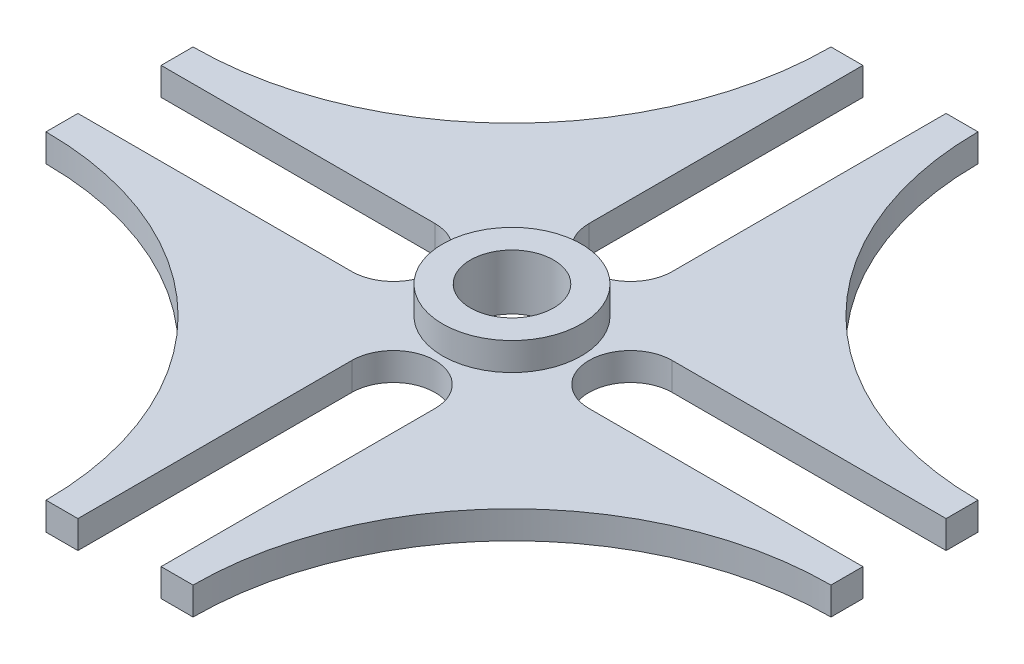
ISO-10303-21;
HEADER;
FILE_DESCRIPTION(('STEP AP214'),'2;1');
FILE_NAME('part.step','',(''),(''),'','','');
FILE_SCHEMA(('AUTOMOTIVE_DESIGN { 1 0 10303 214 1 1 1 1 }'));
ENDSEC;
DATA;
#1=APPLICATION_CONTEXT('core data for automotive mechanical design processes');
#2=APPLICATION_PROTOCOL_DEFINITION('international standard','automotive_design',2000,#1);
#3=PRODUCT_CONTEXT('',#1,'mechanical');
#4=PRODUCT('Part','Part','',(#3));
#5=PRODUCT_RELATED_PRODUCT_CATEGORY('part','',(#4));
#6=PRODUCT_DEFINITION_FORMATION('','',#4);
#7=PRODUCT_DEFINITION_CONTEXT('part definition',#1,'design');
#8=PRODUCT_DEFINITION('design','',#6,#7);
#9=PRODUCT_DEFINITION_SHAPE('','',#8);
#10=(LENGTH_UNIT() NAMED_UNIT(*) SI_UNIT(.MILLI.,.METRE.));
#11=(NAMED_UNIT(*) PLANE_ANGLE_UNIT() SI_UNIT($,.RADIAN.));
#12=(NAMED_UNIT(*) SI_UNIT($,.STERADIAN.) SOLID_ANGLE_UNIT());
#13=UNCERTAINTY_MEASURE_WITH_UNIT(LENGTH_MEASURE(1.E-05),#10,'distance_accuracy_value','');
#14=(GEOMETRIC_REPRESENTATION_CONTEXT(3) GLOBAL_UNCERTAINTY_ASSIGNED_CONTEXT((#13)) GLOBAL_UNIT_ASSIGNED_CONTEXT((#10,
#11,#12)) REPRESENTATION_CONTEXT('',''));
#15=CARTESIAN_POINT('',(0.,0.,0.));
#16=DIRECTION('',(0.,0.,1.));
#17=DIRECTION('',(1.,0.,0.));
#18=AXIS2_PLACEMENT_3D('',#15,#16,#17);
#19=CARTESIAN_POINT('',(6.,4.,-56.6));
#20=DIRECTION('',(0.,0.,1.));
#21=DIRECTION('',(1.,0.,0.));
#22=AXIS2_PLACEMENT_3D('',#19,#20,#21);
#23=PLANE('',#22);
#24=DIRECTION('',(-1.,0.,0.));
#25=VECTOR('',#24,1.);
#26=CARTESIAN_POINT('',(6.,0.,-56.6));
#27=LINE('',#26,#25);
#28=CARTESIAN_POINT('',(10.6,0.,-56.6));
#29=VERTEX_POINT('',#28);
#30=CARTESIAN_POINT('',(6.,0.,-56.6));
#31=VERTEX_POINT('',#30);
#32=EDGE_CURVE('E522',#29,#31,#27,.T.);
#33=ORIENTED_EDGE('',*,*,#32,.T.);
#34=DIRECTION('',(0.,-1.,0.));
#35=VECTOR('',#34,1.);
#36=CARTESIAN_POINT('',(6.,4.,-56.6));
#37=LINE('',#36,#35);
#38=CARTESIAN_POINT('',(6.,4.,-56.6));
#39=VERTEX_POINT('',#38);
#40=EDGE_CURVE('E12',#39,#31,#37,.T.);
#41=ORIENTED_EDGE('',*,*,#40,.F.);
#42=DIRECTION('',(-1.,0.,0.));
#43=VECTOR('',#42,1.);
#44=CARTESIAN_POINT('',(6.,4.,-56.6));
#45=LINE('',#44,#43);
#46=CARTESIAN_POINT('',(10.6,4.,-56.6));
#47=VERTEX_POINT('',#46);
#48=EDGE_CURVE('E478',#47,#39,#45,.T.);
#49=ORIENTED_EDGE('',*,*,#48,.F.);
#50=DIRECTION('',(0.,-1.,0.));
#51=VECTOR('',#50,1.);
#52=CARTESIAN_POINT('',(10.6,4.,-56.6));
#53=LINE('',#52,#51);
#54=EDGE_CURVE('E241',#47,#29,#53,.T.);
#55=ORIENTED_EDGE('',*,*,#54,.T.);
#56=EDGE_LOOP('',(#33,#41,#49,#55));
#57=FACE_BOUND('',#56,.T.);
#58=ADVANCED_FACE('F47',(#57),#23,.F.);
#59=CARTESIAN_POINT('',(6.,4.,-56.6));
#60=DIRECTION('',(1.,0.,0.));
#61=DIRECTION('',(0.,0.,-1.));
#62=AXIS2_PLACEMENT_3D('',#59,#60,#61);
#63=PLANE('',#62);
#64=DIRECTION('',(0.,0.,1.));
#65=VECTOR('',#64,1.);
#66=CARTESIAN_POINT('',(6.,0.,-56.6));
#67=LINE('',#66,#65);
#68=CARTESIAN_POINT('',(6.,0.,-17.1));
#69=VERTEX_POINT('',#68);
#70=EDGE_CURVE('E519',#31,#69,#67,.T.);
#71=ORIENTED_EDGE('',*,*,#70,.T.);
#72=DIRECTION('',(0.,-1.,0.));
#73=VECTOR('',#72,1.);
#74=CARTESIAN_POINT('',(6.,4.,-17.1));
#75=LINE('',#74,#73);
#76=CARTESIAN_POINT('',(6.,4.,-17.1));
#77=VERTEX_POINT('',#76);
#78=EDGE_CURVE('E57',#77,#69,#75,.T.);
#79=ORIENTED_EDGE('',*,*,#78,.F.);
#80=DIRECTION('',(0.,0.,1.));
#81=VECTOR('',#80,1.);
#82=CARTESIAN_POINT('',(6.,4.,-56.6));
#83=LINE('',#82,#81);
#84=EDGE_CURVE('E156',#39,#77,#83,.T.);
#85=ORIENTED_EDGE('',*,*,#84,.F.);
#86=ORIENTED_EDGE('',*,*,#40,.T.);
#87=EDGE_LOOP('',(#71,#79,#85,#86));
#88=FACE_BOUND('',#87,.T.);
#89=ADVANCED_FACE('F934',(#88),#63,.F.);
#90=CARTESIAN_POINT('',(0.,4.,-17.1));
#91=DIRECTION('',(0.,-1.,0.));
#92=DIRECTION('',(0.,0.,-1.));
#93=AXIS2_PLACEMENT_3D('',#90,#91,#92);
#94=CYLINDRICAL_SURFACE('',#93,6.);
#95=CARTESIAN_POINT('',(0.,0.,-17.1));
#96=DIRECTION('',(0.,-1.,0.));
#97=DIRECTION('',(0.,0.,1.));
#98=AXIS2_PLACEMENT_3D('',#95,#96,#97);
#99=CIRCLE('',#98,6.);
#100=CARTESIAN_POINT('',(-6.,0.,-17.1));
#101=VERTEX_POINT('',#100);
#102=EDGE_CURVE('E500',#69,#101,#99,.T.);
#103=ORIENTED_EDGE('',*,*,#102,.T.);
#104=DIRECTION('',(0.,-1.,0.));
#105=VECTOR('',#104,1.);
#106=CARTESIAN_POINT('',(-6.,4.,-17.1));
#107=LINE('',#106,#105);
#108=CARTESIAN_POINT('',(-6.,4.,-17.1));
#109=VERTEX_POINT('',#108);
#110=EDGE_CURVE('E672',#109,#101,#107,.T.);
#111=ORIENTED_EDGE('',*,*,#110,.F.);
#112=CARTESIAN_POINT('',(0.,4.,-17.1));
#113=DIRECTION('',(0.,-1.,0.));
#114=DIRECTION('',(0.,0.,1.));
#115=AXIS2_PLACEMENT_3D('',#112,#113,#114);
#116=CIRCLE('',#115,6.);
#117=EDGE_CURVE('E450',#77,#109,#116,.T.);
#118=ORIENTED_EDGE('',*,*,#117,.F.);
#119=ORIENTED_EDGE('',*,*,#78,.T.);
#120=EDGE_LOOP('',(#103,#111,#118,#119));
#121=FACE_BOUND('',#120,.T.);
#122=ADVANCED_FACE('F938',(#121),#94,.F.);
#123=CARTESIAN_POINT('',(-6.,4.,-17.1));
#124=DIRECTION('',(-1.,0.,0.));
#125=DIRECTION('',(0.,0.,1.));
#126=AXIS2_PLACEMENT_3D('',#123,#124,#125);
#127=PLANE('',#126);
#128=DIRECTION('',(0.,0.,-1.));
#129=VECTOR('',#128,1.);
#130=CARTESIAN_POINT('',(-6.,0.,-17.1));
#131=LINE('',#130,#129);
#132=CARTESIAN_POINT('',(-6.00000000000001,0.,-56.6));
#133=VERTEX_POINT('',#132);
#134=EDGE_CURVE('E495',#101,#133,#131,.T.);
#135=ORIENTED_EDGE('',*,*,#134,.T.);
#136=DIRECTION('',(0.,-1.,0.));
#137=VECTOR('',#136,1.);
#138=CARTESIAN_POINT('',(-6.00000000000001,4.,-56.6));
#139=LINE('',#138,#137);
#140=CARTESIAN_POINT('',(-6.00000000000001,4.,-56.6));
#141=VERTEX_POINT('',#140);
#142=EDGE_CURVE('E687',#141,#133,#139,.T.);
#143=ORIENTED_EDGE('',*,*,#142,.F.);
#144=DIRECTION('',(0.,0.,-1.));
#145=VECTOR('',#144,1.);
#146=CARTESIAN_POINT('',(-6.,4.,-17.1));
#147=LINE('',#146,#145);
#148=EDGE_CURVE('E433',#109,#141,#147,.T.);
#149=ORIENTED_EDGE('',*,*,#148,.F.);
#150=ORIENTED_EDGE('',*,*,#110,.T.);
#151=EDGE_LOOP('',(#135,#143,#149,#150));
#152=FACE_BOUND('',#151,.T.);
#153=ADVANCED_FACE('F942',(#152),#127,.F.);
#154=CARTESIAN_POINT('',(-10.6,4.,-56.6));
#155=DIRECTION('',(0.,0.,1.));
#156=DIRECTION('',(1.,0.,0.));
#157=AXIS2_PLACEMENT_3D('',#154,#155,#156);
#158=PLANE('',#157);
#159=DIRECTION('',(-1.,0.,0.));
#160=VECTOR('',#159,1.);
#161=CARTESIAN_POINT('',(-10.6,0.,-56.6));
#162=LINE('',#161,#160);
#163=CARTESIAN_POINT('',(-10.6,0.,-56.6));
#164=VERTEX_POINT('',#163);
#165=EDGE_CURVE('E499',#133,#164,#162,.T.);
#166=ORIENTED_EDGE('',*,*,#165,.T.);
#167=DIRECTION('',(0.,-1.,0.));
#168=VECTOR('',#167,1.);
#169=CARTESIAN_POINT('',(-10.6,4.,-56.6));
#170=LINE('',#169,#168);
#171=CARTESIAN_POINT('',(-10.6,4.,-56.6));
#172=VERTEX_POINT('',#171);
#173=EDGE_CURVE('E692',#172,#164,#170,.T.);
#174=ORIENTED_EDGE('',*,*,#173,.F.);
#175=DIRECTION('',(-1.,0.,0.));
#176=VECTOR('',#175,1.);
#177=CARTESIAN_POINT('',(-10.6,4.,-56.6));
#178=LINE('',#177,#176);
#179=EDGE_CURVE('E430',#141,#172,#178,.T.);
#180=ORIENTED_EDGE('',*,*,#179,.F.);
#181=ORIENTED_EDGE('',*,*,#142,.T.);
#182=EDGE_LOOP('',(#166,#174,#180,#181));
#183=FACE_BOUND('',#182,.T.);
#184=ADVANCED_FACE('F948',(#183),#158,.F.);
#185=CARTESIAN_POINT('',(-56.6,4.,-56.6));
#186=DIRECTION('',(0.,-1.,0.));
#187=DIRECTION('',(0.,0.,-1.));
#188=AXIS2_PLACEMENT_3D('',#185,#186,#187);
#189=CYLINDRICAL_SURFACE('',#188,46.);
#190=CARTESIAN_POINT('',(-56.6,0.,-56.6));
#191=DIRECTION('',(0.,-1.,0.));
#192=DIRECTION('',(0.,0.,1.));
#193=AXIS2_PLACEMENT_3D('',#190,#191,#192);
#194=CIRCLE('',#193,46.);
#195=CARTESIAN_POINT('',(-56.6,0.,-10.6));
#196=VERTEX_POINT('',#195);
#197=EDGE_CURVE('E858',#164,#196,#194,.T.);
#198=ORIENTED_EDGE('',*,*,#197,.T.);
#199=DIRECTION('',(0.,-1.,0.));
#200=VECTOR('',#199,1.);
#201=CARTESIAN_POINT('',(-56.6,4.,-10.6));
#202=LINE('',#201,#200);
#203=CARTESIAN_POINT('',(-56.6,4.,-10.6));
#204=VERTEX_POINT('',#203);
#205=EDGE_CURVE('E1180',#204,#196,#202,.T.);
#206=ORIENTED_EDGE('',*,*,#205,.F.);
#207=CARTESIAN_POINT('',(-56.6,4.,-56.6));
#208=DIRECTION('',(0.,-1.,0.));
#209=DIRECTION('',(0.,0.,1.));
#210=AXIS2_PLACEMENT_3D('',#207,#208,#209);
#211=CIRCLE('',#210,46.);
#212=EDGE_CURVE('E413',#172,#204,#211,.T.);
#213=ORIENTED_EDGE('',*,*,#212,.F.);
#214=ORIENTED_EDGE('',*,*,#173,.T.);
#215=EDGE_LOOP('',(#198,#206,#213,#214));
#216=FACE_BOUND('',#215,.T.);
#217=ADVANCED_FACE('F952',(#216),#189,.F.);
#218=CARTESIAN_POINT('',(-56.6,4.,-5.99999999999999));
#219=DIRECTION('',(1.,0.,0.));
#220=DIRECTION('',(0.,0.,-1.));
#221=AXIS2_PLACEMENT_3D('',#218,#219,#220);
#222=PLANE('',#221);
#223=DIRECTION('',(0.,0.,1.));
#224=VECTOR('',#223,1.);
#225=CARTESIAN_POINT('',(-56.6,0.,-5.99999999999999));
#226=LINE('',#225,#224);
#227=CARTESIAN_POINT('',(-56.6,0.,-5.99999999999999));
#228=VERTEX_POINT('',#227);
#229=EDGE_CURVE('E543',#196,#228,#226,.T.);
#230=ORIENTED_EDGE('',*,*,#229,.T.);
#231=DIRECTION('',(0.,-1.,0.));
#232=VECTOR('',#231,1.);
#233=CARTESIAN_POINT('',(-56.6,4.,-5.99999999999999));
#234=LINE('',#233,#232);
#235=CARTESIAN_POINT('',(-56.6,4.,-5.99999999999999));
#236=VERTEX_POINT('',#235);
#237=EDGE_CURVE('E735',#236,#228,#234,.T.);
#238=ORIENTED_EDGE('',*,*,#237,.F.);
#239=DIRECTION('',(0.,0.,1.));
#240=VECTOR('',#239,1.);
#241=CARTESIAN_POINT('',(-56.6,4.,-5.99999999999999));
#242=LINE('',#241,#240);
#243=EDGE_CURVE('E410',#204,#236,#242,.T.);
#244=ORIENTED_EDGE('',*,*,#243,.F.);
#245=ORIENTED_EDGE('',*,*,#205,.T.);
#246=EDGE_LOOP('',(#230,#238,#244,#245));
#247=FACE_BOUND('',#246,.T.);
#248=ADVANCED_FACE('F956',(#247),#222,.F.);
#249=CARTESIAN_POINT('',(-56.6,4.,-5.99999999999999));
#250=DIRECTION('',(0.,0.,-1.));
#251=DIRECTION('',(-1.,0.,0.));
#252=AXIS2_PLACEMENT_3D('',#249,#250,#251);
#253=PLANE('',#252);
#254=DIRECTION('',(1.,0.,0.));
#255=VECTOR('',#254,1.);
#256=CARTESIAN_POINT('',(-56.6,0.,-5.99999999999999));
#257=LINE('',#256,#255);
#258=CARTESIAN_POINT('',(-17.1,0.,-6.));
#259=VERTEX_POINT('',#258);
#260=EDGE_CURVE('E537',#228,#259,#257,.T.);
#261=ORIENTED_EDGE('',*,*,#260,.T.);
#262=DIRECTION('',(0.,-1.,0.));
#263=VECTOR('',#262,1.);
#264=CARTESIAN_POINT('',(-17.1,4.,-6.));
#265=LINE('',#264,#263);
#266=CARTESIAN_POINT('',(-17.1,4.,-6.));
#267=VERTEX_POINT('',#266);
#268=EDGE_CURVE('E731',#267,#259,#265,.T.);
#269=ORIENTED_EDGE('',*,*,#268,.F.);
#270=DIRECTION('',(1.,0.,0.));
#271=VECTOR('',#270,1.);
#272=CARTESIAN_POINT('',(-56.6,4.,-5.99999999999999));
#273=LINE('',#272,#271);
#274=EDGE_CURVE('E393',#236,#267,#273,.T.);
#275=ORIENTED_EDGE('',*,*,#274,.F.);
#276=ORIENTED_EDGE('',*,*,#237,.T.);
#277=EDGE_LOOP('',(#261,#269,#275,#276));
#278=FACE_BOUND('',#277,.T.);
#279=ADVANCED_FACE('F960',(#278),#253,.F.);
#280=CARTESIAN_POINT('',(-17.1,4.,0.));
#281=DIRECTION('',(0.,-1.,0.));
#282=DIRECTION('',(0.,0.,-1.));
#283=AXIS2_PLACEMENT_3D('',#280,#281,#282);
#284=CYLINDRICAL_SURFACE('',#283,6.);
#285=CARTESIAN_POINT('',(-17.1,0.,0.));
#286=DIRECTION('',(0.,-1.,0.));
#287=DIRECTION('',(0.,0.,-1.));
#288=AXIS2_PLACEMENT_3D('',#285,#286,#287);
#289=CIRCLE('',#288,6.);
#290=CARTESIAN_POINT('',(-17.1,0.,6.));
#291=VERTEX_POINT('',#290);
#292=EDGE_CURVE('E542',#259,#291,#289,.T.);
#293=ORIENTED_EDGE('',*,*,#292,.T.);
#294=DIRECTION('',(0.,-1.,0.));
#295=VECTOR('',#294,1.);
#296=CARTESIAN_POINT('',(-17.1,4.,6.));
#297=LINE('',#296,#295);
#298=CARTESIAN_POINT('',(-17.1,4.,6.));
#299=VERTEX_POINT('',#298);
#300=EDGE_CURVE('E715',#299,#291,#297,.T.);
#301=ORIENTED_EDGE('',*,*,#300,.F.);
#302=CARTESIAN_POINT('',(-17.1,4.,0.));
#303=DIRECTION('',(0.,-1.,0.));
#304=DIRECTION('',(0.,0.,-1.));
#305=AXIS2_PLACEMENT_3D('',#302,#303,#304);
#306=CIRCLE('',#305,6.);
#307=EDGE_CURVE('E390',#267,#299,#306,.T.);
#308=ORIENTED_EDGE('',*,*,#307,.F.);
#309=ORIENTED_EDGE('',*,*,#268,.T.);
#310=EDGE_LOOP('',(#293,#301,#308,#309));
#311=FACE_BOUND('',#310,.T.);
#312=ADVANCED_FACE('F964',(#311),#284,.F.);
#313=CARTESIAN_POINT('',(-17.1,4.,6.));
#314=DIRECTION('',(0.,0.,1.));
#315=DIRECTION('',(1.,0.,0.));
#316=AXIS2_PLACEMENT_3D('',#313,#314,#315);
#317=PLANE('',#316);
#318=DIRECTION('',(-1.,0.,0.));
#319=VECTOR('',#318,1.);
#320=CARTESIAN_POINT('',(-17.1,0.,6.));
#321=LINE('',#320,#319);
#322=CARTESIAN_POINT('',(-56.6,0.,6.00000000000001));
#323=VERTEX_POINT('',#322);
#324=EDGE_CURVE('E555',#291,#323,#321,.T.);
#325=ORIENTED_EDGE('',*,*,#324,.T.);
#326=DIRECTION('',(0.,-1.,0.));
#327=VECTOR('',#326,1.);
#328=CARTESIAN_POINT('',(-56.6,4.,6.00000000000001));
#329=LINE('',#328,#327);
#330=CARTESIAN_POINT('',(-56.6,4.,6.00000000000001));
#331=VERTEX_POINT('',#330);
#332=EDGE_CURVE('E710',#331,#323,#329,.T.);
#333=ORIENTED_EDGE('',*,*,#332,.F.);
#334=DIRECTION('',(-1.,0.,0.));
#335=VECTOR('',#334,1.);
#336=CARTESIAN_POINT('',(-17.1,4.,6.));
#337=LINE('',#336,#335);
#338=EDGE_CURVE('E373',#299,#331,#337,.T.);
#339=ORIENTED_EDGE('',*,*,#338,.F.);
#340=ORIENTED_EDGE('',*,*,#300,.T.);
#341=EDGE_LOOP('',(#325,#333,#339,#340));
#342=FACE_BOUND('',#341,.T.);
#343=ADVANCED_FACE('F968',(#342),#317,.F.);
#344=CARTESIAN_POINT('',(-56.6,4.,10.6));
#345=DIRECTION('',(1.,0.,0.));
#346=DIRECTION('',(0.,0.,-1.));
#347=AXIS2_PLACEMENT_3D('',#344,#345,#346);
#348=PLANE('',#347);
#349=DIRECTION('',(0.,0.,1.));
#350=VECTOR('',#349,1.);
#351=CARTESIAN_POINT('',(-56.6,0.,10.6));
#352=LINE('',#351,#350);
#353=CARTESIAN_POINT('',(-56.6,0.,10.6));
#354=VERTEX_POINT('',#353);
#355=EDGE_CURVE('E559',#323,#354,#352,.T.);
#356=ORIENTED_EDGE('',*,*,#355,.T.);
#357=DIRECTION('',(0.,-1.,0.));
#358=VECTOR('',#357,1.);
#359=CARTESIAN_POINT('',(-56.6,4.,10.6));
#360=LINE('',#359,#358);
#361=CARTESIAN_POINT('',(-56.6,4.,10.6));
#362=VERTEX_POINT('',#361);
#363=EDGE_CURVE('E716',#362,#354,#360,.T.);
#364=ORIENTED_EDGE('',*,*,#363,.F.);
#365=DIRECTION('',(0.,0.,1.));
#366=VECTOR('',#365,1.);
#367=CARTESIAN_POINT('',(-56.6,4.,10.6));
#368=LINE('',#367,#366);
#369=EDGE_CURVE('E370',#331,#362,#368,.T.);
#370=ORIENTED_EDGE('',*,*,#369,.F.);
#371=ORIENTED_EDGE('',*,*,#332,.T.);
#372=EDGE_LOOP('',(#356,#364,#370,#371));
#373=FACE_BOUND('',#372,.T.);
#374=ADVANCED_FACE('F972',(#373),#348,.F.);
#375=CARTESIAN_POINT('',(-56.6,4.,56.6));
#376=DIRECTION('',(0.,-1.,0.));
#377=DIRECTION('',(0.,0.,-1.));
#378=AXIS2_PLACEMENT_3D('',#375,#376,#377);
#379=CYLINDRICAL_SURFACE('',#378,46.);
#380=CARTESIAN_POINT('',(-56.6,0.,56.6));
#381=DIRECTION('',(0.,-1.,0.));
#382=DIRECTION('',(0.,0.,1.));
#383=AXIS2_PLACEMENT_3D('',#380,#381,#382);
#384=CIRCLE('',#383,46.);
#385=CARTESIAN_POINT('',(-10.6,0.,56.6));
#386=VERTEX_POINT('',#385);
#387=EDGE_CURVE('E869',#354,#386,#384,.T.);
#388=ORIENTED_EDGE('',*,*,#387,.T.);
#389=DIRECTION('',(0.,-1.,0.));
#390=VECTOR('',#389,1.);
#391=CARTESIAN_POINT('',(-10.6,4.,56.6));
#392=LINE('',#391,#390);
#393=CARTESIAN_POINT('',(-10.6,4.,56.6));
#394=VERTEX_POINT('',#393);
#395=EDGE_CURVE('E1189',#394,#386,#392,.T.);
#396=ORIENTED_EDGE('',*,*,#395,.F.);
#397=CARTESIAN_POINT('',(-56.6,4.,56.6));
#398=DIRECTION('',(0.,-1.,0.));
#399=DIRECTION('',(0.,0.,1.));
#400=AXIS2_PLACEMENT_3D('',#397,#398,#399);
#401=CIRCLE('',#400,46.);
#402=EDGE_CURVE('E353',#362,#394,#401,.T.);
#403=ORIENTED_EDGE('',*,*,#402,.F.);
#404=ORIENTED_EDGE('',*,*,#363,.T.);
#405=EDGE_LOOP('',(#388,#396,#403,#404));
#406=FACE_BOUND('',#405,.T.);
#407=ADVANCED_FACE('F976',(#406),#379,.F.);
#408=CARTESIAN_POINT('',(-5.99999999999999,4.,56.6));
#409=DIRECTION('',(0.,0.,-1.));
#410=DIRECTION('',(-1.,0.,0.));
#411=AXIS2_PLACEMENT_3D('',#408,#409,#410);
#412=PLANE('',#411);
#413=DIRECTION('',(1.,0.,0.));
#414=VECTOR('',#413,1.);
#415=CARTESIAN_POINT('',(-5.99999999999999,0.,56.6));
#416=LINE('',#415,#414);
#417=CARTESIAN_POINT('',(-5.99999999999999,0.,56.6));
#418=VERTEX_POINT('',#417);
#419=EDGE_CURVE('E580',#386,#418,#416,.T.);
#420=ORIENTED_EDGE('',*,*,#419,.T.);
#421=DIRECTION('',(0.,-1.,0.));
#422=VECTOR('',#421,1.);
#423=CARTESIAN_POINT('',(-5.99999999999999,4.,56.6));
#424=LINE('',#423,#422);
#425=CARTESIAN_POINT('',(-5.99999999999999,4.,56.6));
#426=VERTEX_POINT('',#425);
#427=EDGE_CURVE('E780',#426,#418,#424,.T.);
#428=ORIENTED_EDGE('',*,*,#427,.F.);
#429=DIRECTION('',(1.,0.,0.));
#430=VECTOR('',#429,1.);
#431=CARTESIAN_POINT('',(-5.99999999999999,4.,56.6));
#432=LINE('',#431,#430);
#433=EDGE_CURVE('E350',#394,#426,#432,.T.);
#434=ORIENTED_EDGE('',*,*,#433,.F.);
#435=ORIENTED_EDGE('',*,*,#395,.T.);
#436=EDGE_LOOP('',(#420,#428,#434,#435));
#437=FACE_BOUND('',#436,.T.);
#438=ADVANCED_FACE('F980',(#437),#412,.F.);
#439=CARTESIAN_POINT('',(-5.99999999999999,4.,56.6));
#440=DIRECTION('',(-1.,0.,0.));
#441=DIRECTION('',(0.,0.,1.));
#442=AXIS2_PLACEMENT_3D('',#439,#440,#441);
#443=PLANE('',#442);
#444=DIRECTION('',(0.,0.,-1.));
#445=VECTOR('',#444,1.);
#446=CARTESIAN_POINT('',(-5.99999999999999,0.,56.6));
#447=LINE('',#446,#445);
#448=CARTESIAN_POINT('',(-6.,0.,17.1));
#449=VERTEX_POINT('',#448);
#450=EDGE_CURVE('E574',#418,#449,#447,.T.);
#451=ORIENTED_EDGE('',*,*,#450,.T.);
#452=DIRECTION('',(0.,-1.,0.));
#453=VECTOR('',#452,1.);
#454=CARTESIAN_POINT('',(-6.,4.,17.1));
#455=LINE('',#454,#453);
#456=CARTESIAN_POINT('',(-6.,4.,17.1));
#457=VERTEX_POINT('',#456);
#458=EDGE_CURVE('E776',#457,#449,#455,.T.);
#459=ORIENTED_EDGE('',*,*,#458,.F.);
#460=DIRECTION('',(0.,0.,-1.));
#461=VECTOR('',#460,1.);
#462=CARTESIAN_POINT('',(-5.99999999999999,4.,56.6));
#463=LINE('',#462,#461);
#464=EDGE_CURVE('E333',#426,#457,#463,.T.);
#465=ORIENTED_EDGE('',*,*,#464,.F.);
#466=ORIENTED_EDGE('',*,*,#427,.T.);
#467=EDGE_LOOP('',(#451,#459,#465,#466));
#468=FACE_BOUND('',#467,.T.);
#469=ADVANCED_FACE('F984',(#468),#443,.F.);
#470=CARTESIAN_POINT('',(0.,4.,17.1));
#471=DIRECTION('',(0.,-1.,0.));
#472=DIRECTION('',(0.,0.,-1.));
#473=AXIS2_PLACEMENT_3D('',#470,#471,#472);
#474=CYLINDRICAL_SURFACE('',#473,6.);
#475=CARTESIAN_POINT('',(0.,0.,17.1));
#476=DIRECTION('',(0.,-1.,0.));
#477=DIRECTION('',(0.,0.,-1.));
#478=AXIS2_PLACEMENT_3D('',#475,#476,#477);
#479=CIRCLE('',#478,6.);
#480=CARTESIAN_POINT('',(6.,0.,17.1));
#481=VERTEX_POINT('',#480);
#482=EDGE_CURVE('E579',#449,#481,#479,.T.);
#483=ORIENTED_EDGE('',*,*,#482,.T.);
#484=DIRECTION('',(0.,-1.,0.));
#485=VECTOR('',#484,1.);
#486=CARTESIAN_POINT('',(6.,4.,17.1));
#487=LINE('',#486,#485);
#488=CARTESIAN_POINT('',(6.,4.,17.1));
#489=VERTEX_POINT('',#488);
#490=EDGE_CURVE('E757',#489,#481,#487,.T.);
#491=ORIENTED_EDGE('',*,*,#490,.F.);
#492=CARTESIAN_POINT('',(0.,4.,17.1));
#493=DIRECTION('',(0.,-1.,0.));
#494=DIRECTION('',(0.,0.,-1.));
#495=AXIS2_PLACEMENT_3D('',#492,#493,#494);
#496=CIRCLE('',#495,6.);
#497=EDGE_CURVE('E330',#457,#489,#496,.T.);
#498=ORIENTED_EDGE('',*,*,#497,.F.);
#499=ORIENTED_EDGE('',*,*,#458,.T.);
#500=EDGE_LOOP('',(#483,#491,#498,#499));
#501=FACE_BOUND('',#500,.T.);
#502=ADVANCED_FACE('F988',(#501),#474,.F.);
#503=CARTESIAN_POINT('',(6.,4.,17.1));
#504=DIRECTION('',(1.,0.,0.));
#505=DIRECTION('',(0.,0.,-1.));
#506=AXIS2_PLACEMENT_3D('',#503,#504,#505);
#507=PLANE('',#506);
#508=DIRECTION('',(0.,0.,1.));
#509=VECTOR('',#508,1.);
#510=CARTESIAN_POINT('',(6.,0.,17.1));
#511=LINE('',#510,#509);
#512=CARTESIAN_POINT('',(6.,0.,56.6));
#513=VERTEX_POINT('',#512);
#514=EDGE_CURVE('E595',#481,#513,#511,.T.);
#515=ORIENTED_EDGE('',*,*,#514,.T.);
#516=DIRECTION('',(0.,-1.,0.));
#517=VECTOR('',#516,1.);
#518=CARTESIAN_POINT('',(6.,4.,56.6));
#519=LINE('',#518,#517);
#520=CARTESIAN_POINT('',(6.,4.,56.6));
#521=VERTEX_POINT('',#520);
#522=EDGE_CURVE('E752',#521,#513,#519,.T.);
#523=ORIENTED_EDGE('',*,*,#522,.F.);
#524=DIRECTION('',(0.,0.,1.));
#525=VECTOR('',#524,1.);
#526=CARTESIAN_POINT('',(6.,4.,17.1));
#527=LINE('',#526,#525);
#528=EDGE_CURVE('E313',#489,#521,#527,.T.);
#529=ORIENTED_EDGE('',*,*,#528,.F.);
#530=ORIENTED_EDGE('',*,*,#490,.T.);
#531=EDGE_LOOP('',(#515,#523,#529,#530));
#532=FACE_BOUND('',#531,.T.);
#533=ADVANCED_FACE('F992',(#532),#507,.F.);
#534=CARTESIAN_POINT('',(10.6,4.,56.6));
#535=DIRECTION('',(0.,0.,-1.));
#536=DIRECTION('',(-1.,0.,0.));
#537=AXIS2_PLACEMENT_3D('',#534,#535,#536);
#538=PLANE('',#537);
#539=DIRECTION('',(1.,0.,0.));
#540=VECTOR('',#539,1.);
#541=CARTESIAN_POINT('',(10.6,0.,56.6));
#542=LINE('',#541,#540);
#543=CARTESIAN_POINT('',(10.6,0.,56.6));
#544=VERTEX_POINT('',#543);
#545=EDGE_CURVE('E599',#513,#544,#542,.T.);
#546=ORIENTED_EDGE('',*,*,#545,.T.);
#547=DIRECTION('',(0.,-1.,0.));
#548=VECTOR('',#547,1.);
#549=CARTESIAN_POINT('',(10.6,4.,56.6));
#550=LINE('',#549,#548);
#551=CARTESIAN_POINT('',(10.6,4.,56.6));
#552=VERTEX_POINT('',#551);
#553=EDGE_CURVE('E758',#552,#544,#550,.T.);
#554=ORIENTED_EDGE('',*,*,#553,.F.);
#555=DIRECTION('',(1.,0.,0.));
#556=VECTOR('',#555,1.);
#557=CARTESIAN_POINT('',(10.6,4.,56.6));
#558=LINE('',#557,#556);
#559=EDGE_CURVE('E310',#521,#552,#558,.T.);
#560=ORIENTED_EDGE('',*,*,#559,.F.);
#561=ORIENTED_EDGE('',*,*,#522,.T.);
#562=EDGE_LOOP('',(#546,#554,#560,#561));
#563=FACE_BOUND('',#562,.T.);
#564=ADVANCED_FACE('F996',(#563),#538,.F.);
#565=CARTESIAN_POINT('',(56.6,4.,56.6));
#566=DIRECTION('',(0.,-1.,0.));
#567=DIRECTION('',(0.,0.,-1.));
#568=AXIS2_PLACEMENT_3D('',#565,#566,#567);
#569=CYLINDRICAL_SURFACE('',#568,46.);
#570=CARTESIAN_POINT('',(56.6,0.,56.6));
#571=DIRECTION('',(0.,-1.,0.));
#572=DIRECTION('',(0.,0.,1.));
#573=AXIS2_PLACEMENT_3D('',#570,#571,#572);
#574=CIRCLE('',#573,46.);
#575=CARTESIAN_POINT('',(56.6,0.,10.6));
#576=VERTEX_POINT('',#575);
#577=EDGE_CURVE('E877',#544,#576,#574,.T.);
#578=ORIENTED_EDGE('',*,*,#577,.T.);
#579=DIRECTION('',(0.,-1.,0.));
#580=VECTOR('',#579,1.);
#581=CARTESIAN_POINT('',(56.6,4.,10.6));
#582=LINE('',#581,#580);
#583=CARTESIAN_POINT('',(56.6,4.,10.6));
#584=VERTEX_POINT('',#583);
#585=EDGE_CURVE('E1198',#584,#576,#582,.T.);
#586=ORIENTED_EDGE('',*,*,#585,.F.);
#587=CARTESIAN_POINT('',(56.6,4.,56.6));
#588=DIRECTION('',(0.,-1.,0.));
#589=DIRECTION('',(0.,0.,1.));
#590=AXIS2_PLACEMENT_3D('',#587,#588,#589);
#591=CIRCLE('',#590,46.);
#592=EDGE_CURVE('E293',#552,#584,#591,.T.);
#593=ORIENTED_EDGE('',*,*,#592,.F.);
#594=ORIENTED_EDGE('',*,*,#553,.T.);
#595=EDGE_LOOP('',(#578,#586,#593,#594));
#596=FACE_BOUND('',#595,.T.);
#597=ADVANCED_FACE('F1000',(#596),#569,.F.);
#598=CARTESIAN_POINT('',(56.6,4.,6.));
#599=DIRECTION('',(-1.,0.,0.));
#600=DIRECTION('',(0.,0.,1.));
#601=AXIS2_PLACEMENT_3D('',#598,#599,#600);
#602=PLANE('',#601);
#603=DIRECTION('',(0.,0.,-1.));
#604=VECTOR('',#603,1.);
#605=CARTESIAN_POINT('',(56.6,0.,6.));
#606=LINE('',#605,#604);
#607=CARTESIAN_POINT('',(56.6,0.,6.));
#608=VERTEX_POINT('',#607);
#609=EDGE_CURVE('E620',#576,#608,#606,.T.);
#610=ORIENTED_EDGE('',*,*,#609,.T.);
#611=DIRECTION('',(0.,-1.,0.));
#612=VECTOR('',#611,1.);
#613=CARTESIAN_POINT('',(56.6,4.,6.));
#614=LINE('',#613,#612);
#615=CARTESIAN_POINT('',(56.6,4.,6.));
#616=VERTEX_POINT('',#615);
#617=EDGE_CURVE('E818',#616,#608,#614,.T.);
#618=ORIENTED_EDGE('',*,*,#617,.F.);
#619=DIRECTION('',(0.,0.,-1.));
#620=VECTOR('',#619,1.);
#621=CARTESIAN_POINT('',(56.6,4.,6.));
#622=LINE('',#621,#620);
#623=EDGE_CURVE('E290',#584,#616,#622,.T.);
#624=ORIENTED_EDGE('',*,*,#623,.F.);
#625=ORIENTED_EDGE('',*,*,#585,.T.);
#626=EDGE_LOOP('',(#610,#618,#624,#625));
#627=FACE_BOUND('',#626,.T.);
#628=ADVANCED_FACE('F1004',(#627),#602,.F.);
#629=CARTESIAN_POINT('',(56.6,4.,6.));
#630=DIRECTION('',(0.,0.,1.));
#631=DIRECTION('',(1.,0.,0.));
#632=AXIS2_PLACEMENT_3D('',#629,#630,#631);
#633=PLANE('',#632);
#634=DIRECTION('',(-1.,0.,0.));
#635=VECTOR('',#634,1.);
#636=CARTESIAN_POINT('',(56.6,0.,6.));
#637=LINE('',#636,#635);
#638=CARTESIAN_POINT('',(17.1,0.,6.));
#639=VERTEX_POINT('',#638);
#640=EDGE_CURVE('E614',#608,#639,#637,.T.);
#641=ORIENTED_EDGE('',*,*,#640,.T.);
#642=DIRECTION('',(0.,-1.,0.));
#643=VECTOR('',#642,1.);
#644=CARTESIAN_POINT('',(17.1,4.,6.));
#645=LINE('',#644,#643);
#646=CARTESIAN_POINT('',(17.1,4.,6.));
#647=VERTEX_POINT('',#646);
#648=EDGE_CURVE('E814',#647,#639,#645,.T.);
#649=ORIENTED_EDGE('',*,*,#648,.F.);
#650=DIRECTION('',(-1.,0.,0.));
#651=VECTOR('',#650,1.);
#652=CARTESIAN_POINT('',(56.6,4.,6.));
#653=LINE('',#652,#651);
#654=EDGE_CURVE('E272',#616,#647,#653,.T.);
#655=ORIENTED_EDGE('',*,*,#654,.F.);
#656=ORIENTED_EDGE('',*,*,#617,.T.);
#657=EDGE_LOOP('',(#641,#649,#655,#656));
#658=FACE_BOUND('',#657,.T.);
#659=ADVANCED_FACE('F1008',(#658),#633,.F.);
#660=CARTESIAN_POINT('',(17.1,4.,0.));
#661=DIRECTION('',(0.,-1.,0.));
#662=DIRECTION('',(0.,0.,-1.));
#663=AXIS2_PLACEMENT_3D('',#660,#661,#662);
#664=CYLINDRICAL_SURFACE('',#663,6.);
#665=CARTESIAN_POINT('',(17.1,0.,0.));
#666=DIRECTION('',(0.,-1.,0.));
#667=DIRECTION('',(0.,0.,1.));
#668=AXIS2_PLACEMENT_3D('',#665,#666,#667);
#669=CIRCLE('',#668,6.);
#670=CARTESIAN_POINT('',(17.1,0.,-6.));
#671=VERTEX_POINT('',#670);
#672=EDGE_CURVE('E619',#639,#671,#669,.T.);
#673=ORIENTED_EDGE('',*,*,#672,.T.);
#674=DIRECTION('',(0.,-1.,0.));
#675=VECTOR('',#674,1.);
#676=CARTESIAN_POINT('',(17.1,4.,-6.));
#677=LINE('',#676,#675);
#678=CARTESIAN_POINT('',(17.1,4.,-6.));
#679=VERTEX_POINT('',#678);
#680=EDGE_CURVE('E234',#679,#671,#677,.T.);
#681=ORIENTED_EDGE('',*,*,#680,.F.);
#682=CARTESIAN_POINT('',(17.1,4.,0.));
#683=DIRECTION('',(0.,-1.,0.));
#684=DIRECTION('',(0.,0.,1.));
#685=AXIS2_PLACEMENT_3D('',#682,#683,#684);
#686=CIRCLE('',#685,6.);
#687=EDGE_CURVE('E223',#647,#679,#686,.T.);
#688=ORIENTED_EDGE('',*,*,#687,.F.);
#689=ORIENTED_EDGE('',*,*,#648,.T.);
#690=EDGE_LOOP('',(#673,#681,#688,#689));
#691=FACE_BOUND('',#690,.T.);
#692=ADVANCED_FACE('F1012',(#691),#664,.F.);
#693=CARTESIAN_POINT('',(17.1,4.,-6.));
#694=DIRECTION('',(0.,0.,-1.));
#695=DIRECTION('',(-1.,0.,0.));
#696=AXIS2_PLACEMENT_3D('',#693,#694,#695);
#697=PLANE('',#696);
#698=DIRECTION('',(1.,0.,0.));
#699=VECTOR('',#698,1.);
#700=CARTESIAN_POINT('',(17.1,0.,-6.));
#701=LINE('',#700,#699);
#702=CARTESIAN_POINT('',(56.6,0.,-5.99999999999998));
#703=VERTEX_POINT('',#702);
#704=EDGE_CURVE('E232',#671,#703,#701,.T.);
#705=ORIENTED_EDGE('',*,*,#704,.T.);
#706=DIRECTION('',(0.,-1.,0.));
#707=VECTOR('',#706,1.);
#708=CARTESIAN_POINT('',(56.6,4.,-5.99999999999998));
#709=LINE('',#708,#707);
#710=CARTESIAN_POINT('',(56.6,4.,-5.99999999999998));
#711=VERTEX_POINT('',#710);
#712=EDGE_CURVE('E229',#711,#703,#709,.T.);
#713=ORIENTED_EDGE('',*,*,#712,.F.);
#714=DIRECTION('',(1.,0.,0.));
#715=VECTOR('',#714,1.);
#716=CARTESIAN_POINT('',(17.1,4.,-6.));
#717=LINE('',#716,#715);
#718=EDGE_CURVE('E217',#679,#711,#717,.T.);
#719=ORIENTED_EDGE('',*,*,#718,.F.);
#720=ORIENTED_EDGE('',*,*,#680,.T.);
#721=EDGE_LOOP('',(#705,#713,#719,#720));
#722=FACE_BOUND('',#721,.T.);
#723=ADVANCED_FACE('F230',(#722),#697,.F.);
#724=CARTESIAN_POINT('',(56.6,4.,-10.6));
#725=DIRECTION('',(-1.,0.,0.));
#726=DIRECTION('',(0.,0.,1.));
#727=AXIS2_PLACEMENT_3D('',#724,#725,#726);
#728=PLANE('',#727);
#729=DIRECTION('',(0.,0.,-1.));
#730=VECTOR('',#729,1.);
#731=CARTESIAN_POINT('',(56.6,0.,-10.6));
#732=LINE('',#731,#730);
#733=CARTESIAN_POINT('',(56.6,0.,-10.6));
#734=VERTEX_POINT('',#733);
#735=EDGE_CURVE('E142',#703,#734,#732,.T.);
#736=ORIENTED_EDGE('',*,*,#735,.T.);
#737=DIRECTION('',(0.,-1.,0.));
#738=VECTOR('',#737,1.);
#739=CARTESIAN_POINT('',(56.6,4.,-10.6));
#740=LINE('',#739,#738);
#741=CARTESIAN_POINT('',(56.6,4.,-10.6));
#742=VERTEX_POINT('',#741);
#743=EDGE_CURVE('E235',#742,#734,#740,.T.);
#744=ORIENTED_EDGE('',*,*,#743,.F.);
#745=DIRECTION('',(0.,0.,-1.));
#746=VECTOR('',#745,1.);
#747=CARTESIAN_POINT('',(56.6,4.,-10.6));
#748=LINE('',#747,#746);
#749=EDGE_CURVE('E221',#711,#742,#748,.T.);
#750=ORIENTED_EDGE('',*,*,#749,.F.);
#751=ORIENTED_EDGE('',*,*,#712,.T.);
#752=EDGE_LOOP('',(#736,#744,#750,#751));
#753=FACE_BOUND('',#752,.T.);
#754=ADVANCED_FACE('F237',(#753),#728,.F.);
#755=CARTESIAN_POINT('',(56.6,4.,-56.6));
#756=DIRECTION('',(0.,-1.,0.));
#757=DIRECTION('',(0.,0.,-1.));
#758=AXIS2_PLACEMENT_3D('',#755,#756,#757);
#759=CYLINDRICAL_SURFACE('',#758,46.);
#760=CARTESIAN_POINT('',(56.6,0.,-56.6));
#761=DIRECTION('',(0.,-1.,0.));
#762=DIRECTION('',(0.,0.,1.));
#763=AXIS2_PLACEMENT_3D('',#760,#761,#762);
#764=CIRCLE('',#763,46.);
#765=EDGE_CURVE('E148',#734,#29,#764,.T.);
#766=ORIENTED_EDGE('',*,*,#765,.T.);
#767=ORIENTED_EDGE('',*,*,#54,.F.);
#768=CARTESIAN_POINT('',(56.6,4.,-56.6));
#769=DIRECTION('',(0.,-1.,0.));
#770=DIRECTION('',(0.,0.,1.));
#771=AXIS2_PLACEMENT_3D('',#768,#769,#770);
#772=CIRCLE('',#771,46.);
#773=EDGE_CURVE('E65',#742,#47,#772,.T.);
#774=ORIENTED_EDGE('',*,*,#773,.F.);
#775=ORIENTED_EDGE('',*,*,#743,.T.);
#776=EDGE_LOOP('',(#766,#767,#774,#775));
#777=FACE_BOUND('',#776,.T.);
#778=ADVANCED_FACE('F904',(#777),#759,.F.);
#779=CARTESIAN_POINT('',(56.6,4.,-56.6));
#780=DIRECTION('',(0.,1.,0.));
#781=DIRECTION('',(0.,0.,1.));
#782=AXIS2_PLACEMENT_3D('',#779,#780,#781);
#783=PLANE('',#782);
#784=CARTESIAN_POINT('',(0.,4.,0.));
#785=DIRECTION('',(0.,1.,0.));
#786=DIRECTION('',(0.,0.,1.));
#787=AXIS2_PLACEMENT_3D('',#784,#785,#786);
#788=CIRCLE('',#787,10.);
#789=CARTESIAN_POINT('',(0.,4.,10.));
#790=VERTEX_POINT('',#789);
#791=EDGE_CURVE('E470',#790,#790,#788,.T.);
#792=ORIENTED_EDGE('',*,*,#791,.F.);
#793=EDGE_LOOP('',(#792));
#794=FACE_BOUND('',#793,.T.);
#795=ORIENTED_EDGE('',*,*,#48,.T.);
#796=ORIENTED_EDGE('',*,*,#84,.T.);
#797=ORIENTED_EDGE('',*,*,#117,.T.);
#798=ORIENTED_EDGE('',*,*,#148,.T.);
#799=ORIENTED_EDGE('',*,*,#179,.T.);
#800=ORIENTED_EDGE('',*,*,#212,.T.);
#801=ORIENTED_EDGE('',*,*,#243,.T.);
#802=ORIENTED_EDGE('',*,*,#274,.T.);
#803=ORIENTED_EDGE('',*,*,#307,.T.);
#804=ORIENTED_EDGE('',*,*,#338,.T.);
#805=ORIENTED_EDGE('',*,*,#369,.T.);
#806=ORIENTED_EDGE('',*,*,#402,.T.);
#807=ORIENTED_EDGE('',*,*,#433,.T.);
#808=ORIENTED_EDGE('',*,*,#464,.T.);
#809=ORIENTED_EDGE('',*,*,#497,.T.);
#810=ORIENTED_EDGE('',*,*,#528,.T.);
#811=ORIENTED_EDGE('',*,*,#559,.T.);
#812=ORIENTED_EDGE('',*,*,#592,.T.);
#813=ORIENTED_EDGE('',*,*,#623,.T.);
#814=ORIENTED_EDGE('',*,*,#654,.T.);
#815=ORIENTED_EDGE('',*,*,#687,.T.);
#816=ORIENTED_EDGE('',*,*,#718,.T.);
#817=ORIENTED_EDGE('',*,*,#749,.T.);
#818=ORIENTED_EDGE('',*,*,#773,.T.);
#819=EDGE_LOOP('',(#795,#796,#797,#798,#799,#800,#801,#802,#803,#804,#805,#806,#807,#808,#809,
#810,#811,#812,#813,#814,#815,#816,#817,#818));
#820=FACE_BOUND('',#819,.T.);
#821=ADVANCED_FACE('F219',(#794,#820),#783,.T.);
#822=CARTESIAN_POINT('',(56.6,0.,-56.6));
#823=DIRECTION('',(0.,1.,0.));
#824=DIRECTION('',(0.,0.,1.));
#825=AXIS2_PLACEMENT_3D('',#822,#823,#824);
#826=PLANE('',#825);
#827=CARTESIAN_POINT('',(0.,0.,0.));
#828=DIRECTION('',(0.,1.,0.));
#829=DIRECTION('',(0.,0.,1.));
#830=AXIS2_PLACEMENT_3D('',#827,#828,#829);
#831=CIRCLE('',#830,6.);
#832=CARTESIAN_POINT('',(0.,0.,6.));
#833=VERTEX_POINT('',#832);
#834=EDGE_CURVE('E475',#833,#833,#831,.T.);
#835=ORIENTED_EDGE('',*,*,#834,.T.);
#836=EDGE_LOOP('',(#835));
#837=FACE_BOUND('',#836,.T.);
#838=ORIENTED_EDGE('',*,*,#32,.F.);
#839=ORIENTED_EDGE('',*,*,#765,.F.);
#840=ORIENTED_EDGE('',*,*,#735,.F.);
#841=ORIENTED_EDGE('',*,*,#704,.F.);
#842=ORIENTED_EDGE('',*,*,#672,.F.);
#843=ORIENTED_EDGE('',*,*,#640,.F.);
#844=ORIENTED_EDGE('',*,*,#609,.F.);
#845=ORIENTED_EDGE('',*,*,#577,.F.);
#846=ORIENTED_EDGE('',*,*,#545,.F.);
#847=ORIENTED_EDGE('',*,*,#514,.F.);
#848=ORIENTED_EDGE('',*,*,#482,.F.);
#849=ORIENTED_EDGE('',*,*,#450,.F.);
#850=ORIENTED_EDGE('',*,*,#419,.F.);
#851=ORIENTED_EDGE('',*,*,#387,.F.);
#852=ORIENTED_EDGE('',*,*,#355,.F.);
#853=ORIENTED_EDGE('',*,*,#324,.F.);
#854=ORIENTED_EDGE('',*,*,#292,.F.);
#855=ORIENTED_EDGE('',*,*,#260,.F.);
#856=ORIENTED_EDGE('',*,*,#229,.F.);
#857=ORIENTED_EDGE('',*,*,#197,.F.);
#858=ORIENTED_EDGE('',*,*,#165,.F.);
#859=ORIENTED_EDGE('',*,*,#134,.F.);
#860=ORIENTED_EDGE('',*,*,#102,.F.);
#861=ORIENTED_EDGE('',*,*,#70,.F.);
#862=EDGE_LOOP('',(#838,#839,#840,#841,#842,#843,#844,#845,#846,#847,#848,#849,#850,#851,#852,
#853,#854,#855,#856,#857,#858,#859,#860,#861));
#863=FACE_BOUND('',#862,.T.);
#864=ADVANCED_FACE('F906',(#837,#863),#826,.F.);
#865=CARTESIAN_POINT('',(0.,8.,0.));
#866=DIRECTION('',(0.,-1.,0.));
#867=DIRECTION('',(0.,0.,-1.));
#868=AXIS2_PLACEMENT_3D('',#865,#866,#867);
#869=CYLINDRICAL_SURFACE('',#868,10.);
#870=CARTESIAN_POINT('',(0.,8.,0.));
#871=DIRECTION('',(0.,1.,0.));
#872=DIRECTION('',(0.,0.,1.));
#873=AXIS2_PLACEMENT_3D('',#870,#871,#872);
#874=CIRCLE('',#873,10.);
#875=CARTESIAN_POINT('',(0.,8.,10.));
#876=VERTEX_POINT('',#875);
#877=EDGE_CURVE('E474',#876,#876,#874,.T.);
#878=ORIENTED_EDGE('',*,*,#877,.F.);
#879=EDGE_LOOP('',(#878));
#880=FACE_BOUND('',#879,.T.);
#881=ORIENTED_EDGE('',*,*,#791,.T.);
#882=EDGE_LOOP('',(#881));
#883=FACE_BOUND('',#882,.T.);
#884=ADVANCED_FACE('F918',(#880,#883),#869,.T.);
#885=CARTESIAN_POINT('',(0.,8.,0.));
#886=DIRECTION('',(0.,1.,0.));
#887=DIRECTION('',(0.,0.,1.));
#888=AXIS2_PLACEMENT_3D('',#885,#886,#887);
#889=PLANE('',#888);
#890=CARTESIAN_POINT('',(0.,8.,0.));
#891=DIRECTION('',(0.,1.,0.));
#892=DIRECTION('',(0.,0.,1.));
#893=AXIS2_PLACEMENT_3D('',#890,#891,#892);
#894=CIRCLE('',#893,6.);
#895=CARTESIAN_POINT('',(0.,8.,6.));
#896=VERTEX_POINT('',#895);
#897=EDGE_CURVE('E650',#896,#896,#894,.T.);
#898=ORIENTED_EDGE('',*,*,#897,.F.);
#899=EDGE_LOOP('',(#898));
#900=FACE_BOUND('',#899,.T.);
#901=ORIENTED_EDGE('',*,*,#877,.T.);
#902=EDGE_LOOP('',(#901));
#903=FACE_BOUND('',#902,.T.);
#904=ADVANCED_FACE('F916',(#900,#903),#889,.T.);
#905=CARTESIAN_POINT('',(0.,0.,0.));
#906=DIRECTION('',(0.,1.,0.));
#907=DIRECTION('',(0.,0.,1.));
#908=AXIS2_PLACEMENT_3D('',#905,#906,#907);
#909=CYLINDRICAL_SURFACE('',#908,6.);
#910=ORIENTED_EDGE('',*,*,#834,.F.);
#911=EDGE_LOOP('',(#910));
#912=FACE_BOUND('',#911,.T.);
#913=ORIENTED_EDGE('',*,*,#897,.T.);
#914=EDGE_LOOP('',(#913));
#915=FACE_BOUND('',#914,.T.);
#916=ADVANCED_FACE('F1050',(#912,#915),#909,.F.);
#917=CLOSED_SHELL('',(#58,#89,#122,#153,#184,#217,#248,#279,#312,#343,#374,#407,#438,#469,#502,
#533,#564,#597,#628,#659,#692,#723,#754,#778,#821,#864,#884,#904,#916));
#918=MANIFOLD_SOLID_BREP('B2',#917);
#919=ADVANCED_BREP_SHAPE_REPRESENTATION('',(#18,#918),#14);
#920=SHAPE_DEFINITION_REPRESENTATION(#9,#919);
ENDSEC;
END-ISO-10303-21;
